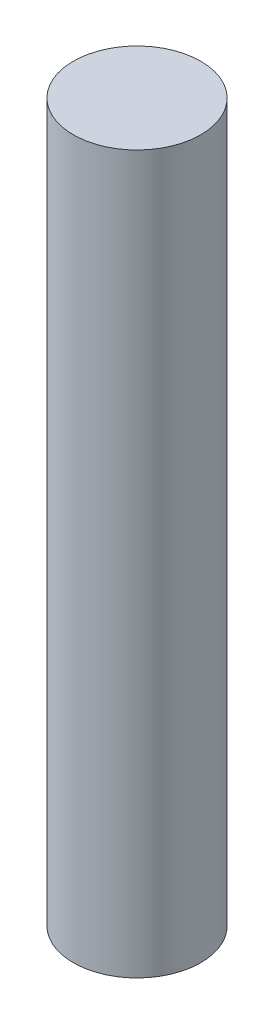
ISO-10303-21;
HEADER;
FILE_DESCRIPTION(('STEP AP214'),'2;1');
FILE_NAME('part.step','',(''),(''),'','','');
FILE_SCHEMA(('AUTOMOTIVE_DESIGN { 1 0 10303 214 1 1 1 1 }'));
ENDSEC;
DATA;
#1=APPLICATION_CONTEXT('core data for automotive mechanical design processes');
#2=APPLICATION_PROTOCOL_DEFINITION('international standard','automotive_design',2000,#1);
#3=PRODUCT_CONTEXT('',#1,'mechanical');
#4=PRODUCT('Part','Part','',(#3));
#5=PRODUCT_RELATED_PRODUCT_CATEGORY('part','',(#4));
#6=PRODUCT_DEFINITION_FORMATION('','',#4);
#7=PRODUCT_DEFINITION_CONTEXT('part definition',#1,'design');
#8=PRODUCT_DEFINITION('design','',#6,#7);
#9=PRODUCT_DEFINITION_SHAPE('','',#8);
#10=(LENGTH_UNIT() NAMED_UNIT(*) SI_UNIT(.MILLI.,.METRE.));
#11=(NAMED_UNIT(*) PLANE_ANGLE_UNIT() SI_UNIT($,.RADIAN.));
#12=(NAMED_UNIT(*) SI_UNIT($,.STERADIAN.) SOLID_ANGLE_UNIT());
#13=UNCERTAINTY_MEASURE_WITH_UNIT(LENGTH_MEASURE(1.E-05),#10,'distance_accuracy_value','');
#14=(GEOMETRIC_REPRESENTATION_CONTEXT(3) GLOBAL_UNCERTAINTY_ASSIGNED_CONTEXT((#13)) GLOBAL_UNIT_ASSIGNED_CONTEXT((#10,
#11,#12)) REPRESENTATION_CONTEXT('',''));
#15=CARTESIAN_POINT('',(0.,0.,0.));
#16=DIRECTION('',(0.,0.,1.));
#17=DIRECTION('',(1.,0.,0.));
#18=AXIS2_PLACEMENT_3D('',#15,#16,#17);
#19=CARTESIAN_POINT('',(350.,560.,-300.));
#20=DIRECTION('',(0.,-1.,0.));
#21=DIRECTION('',(0.,0.,-1.));
#22=AXIS2_PLACEMENT_3D('',#19,#20,#21);
#23=CYLINDRICAL_SURFACE('',#22,8.00000000000001);
#24=CARTESIAN_POINT('',(350.,560.,-300.));
#25=DIRECTION('',(0.,1.,0.));
#26=DIRECTION('',(0.,0.,1.));
#27=AXIS2_PLACEMENT_3D('',#24,#25,#26);
#28=CIRCLE('',#27,8.00000000000001);
#29=CARTESIAN_POINT('',(350.,560.,-308.));
#30=VERTEX_POINT('',#29);
#31=EDGE_CURVE('E10',#30,#30,#28,.T.);
#32=CARTESIAN_POINT('',(350.,470.,-300.));
#33=DIRECTION('',(0.,1.,0.));
#34=DIRECTION('',(0.,0.,1.));
#35=AXIS2_PLACEMENT_3D('',#32,#33,#34);
#36=CIRCLE('',#35,8.00000000000001);
#37=CARTESIAN_POINT('',(350.,470.,-308.));
#38=VERTEX_POINT('',#37);
#39=EDGE_CURVE('E40',#38,#38,#36,.T.);
#40=CARTESIAN_POINT('',(350.,560.,-308.));
#41=CARTESIAN_POINT('',(350.,559.0625,-308.));
#42=CARTESIAN_POINT('',(350.,558.125,-308.));
#43=CARTESIAN_POINT('',(350.,556.25,-308.));
#44=CARTESIAN_POINT('',(350.,555.3125,-308.));
#45=CARTESIAN_POINT('',(350.,553.4375,-308.));
#46=CARTESIAN_POINT('',(350.,552.5,-308.));
#47=CARTESIAN_POINT('',(350.,550.625,-308.));
#48=CARTESIAN_POINT('',(350.,549.6875,-308.));
#49=CARTESIAN_POINT('',(350.,547.8125,-308.));
#50=CARTESIAN_POINT('',(350.,546.875,-308.));
#51=CARTESIAN_POINT('',(350.,545.,-308.));
#52=CARTESIAN_POINT('',(350.,544.0625,-308.));
#53=CARTESIAN_POINT('',(350.,542.1875,-308.));
#54=CARTESIAN_POINT('',(350.,541.25,-308.));
#55=CARTESIAN_POINT('',(350.,539.375,-308.));
#56=CARTESIAN_POINT('',(350.,538.4375,-308.));
#57=CARTESIAN_POINT('',(350.,536.5625,-308.));
#58=CARTESIAN_POINT('',(350.,535.625,-308.));
#59=CARTESIAN_POINT('',(350.,533.75,-308.));
#60=CARTESIAN_POINT('',(350.,532.8125,-308.));
#61=CARTESIAN_POINT('',(350.,530.9375,-308.));
#62=CARTESIAN_POINT('',(350.,530.,-308.));
#63=CARTESIAN_POINT('',(350.,528.125,-308.));
#64=CARTESIAN_POINT('',(350.,527.1875,-308.));
#65=CARTESIAN_POINT('',(350.,525.3125,-308.));
#66=CARTESIAN_POINT('',(350.,524.375,-308.));
#67=CARTESIAN_POINT('',(350.,522.5,-308.));
#68=CARTESIAN_POINT('',(350.,521.5625,-308.));
#69=CARTESIAN_POINT('',(350.,519.6875,-308.));
#70=CARTESIAN_POINT('',(350.,518.75,-308.));
#71=CARTESIAN_POINT('',(350.,516.875,-308.));
#72=CARTESIAN_POINT('',(350.,515.9375,-308.));
#73=CARTESIAN_POINT('',(350.,514.0625,-308.));
#74=CARTESIAN_POINT('',(350.,513.125,-308.));
#75=CARTESIAN_POINT('',(350.,511.25,-308.));
#76=CARTESIAN_POINT('',(350.,510.3125,-308.));
#77=CARTESIAN_POINT('',(350.,508.4375,-308.));
#78=CARTESIAN_POINT('',(350.,507.5,-308.));
#79=CARTESIAN_POINT('',(350.,505.625,-308.));
#80=CARTESIAN_POINT('',(350.,504.6875,-308.));
#81=CARTESIAN_POINT('',(350.,502.8125,-308.));
#82=CARTESIAN_POINT('',(350.,501.875,-308.));
#83=CARTESIAN_POINT('',(350.,500.,-308.));
#84=CARTESIAN_POINT('',(350.,499.0625,-308.));
#85=CARTESIAN_POINT('',(350.,497.1875,-308.));
#86=CARTESIAN_POINT('',(350.,496.25,-308.));
#87=CARTESIAN_POINT('',(350.,494.375,-308.));
#88=CARTESIAN_POINT('',(350.,493.4375,-308.));
#89=CARTESIAN_POINT('',(350.,491.5625,-308.));
#90=CARTESIAN_POINT('',(350.,490.625,-308.));
#91=CARTESIAN_POINT('',(350.,488.75,-308.));
#92=CARTESIAN_POINT('',(350.,487.8125,-308.));
#93=CARTESIAN_POINT('',(350.,485.9375,-308.));
#94=CARTESIAN_POINT('',(350.,485.,-308.));
#95=CARTESIAN_POINT('',(350.,483.125,-308.));
#96=CARTESIAN_POINT('',(350.,482.1875,-308.));
#97=CARTESIAN_POINT('',(350.,480.3125,-308.));
#98=CARTESIAN_POINT('',(350.,479.375,-308.));
#99=CARTESIAN_POINT('',(350.,477.5,-308.));
#100=CARTESIAN_POINT('',(350.,476.5625,-308.));
#101=CARTESIAN_POINT('',(350.,474.6875,-308.));
#102=CARTESIAN_POINT('',(350.,473.75,-308.));
#103=CARTESIAN_POINT('',(350.,471.875,-308.));
#104=CARTESIAN_POINT('',(350.,470.9375,-308.));
#105=CARTESIAN_POINT('',(350.,470.,-308.));
#106=B_SPLINE_CURVE_WITH_KNOTS('',3,(#40,#41,#42,#43,#44,#45,#46,#47,#48,#49,#50,#51,#52,#53,
#54,#55,#56,#57,#58,#59,#60,#61,#62,#63,#64,#65,#66,#67,#68,#69,#70,#71,#72,#73,#74,#75,#76,#77,
#78,#79,#80,#81,#82,#83,#84,#85,#86,#87,#88,#89,#90,#91,#92,#93,#94,#95,#96,#97,#98,#99,#100,
#101,#102,#103,#104,#105),.UNSPECIFIED.,.F.,.F.,(4,2,2,2,2,2,2,2,2,2,2,2,2,2,2,2,2,2,2,2,2,2,2,
2,2,2,2,2,2,2,2,2,4),(0.,2.8125,5.62499999999999,8.43749999999999,11.25,14.0625,16.875,19.6875,
22.5,25.3125,28.125,30.9375,33.7499999999999,36.5624999999999,39.3749999999999,42.1874999999999,
44.9999999999999,47.8124999999999,50.6249999999999,53.4374999999999,56.2499999999999,
59.0624999999999,61.875,64.6874999999999,67.4999999999999,70.3124999999999,73.1249999999999,
75.9374999999999,78.7499999999999,81.5624999999999,84.3749999999999,87.1874999999999,
89.9999999999999),.UNSPECIFIED.);
#107=EDGE_CURVE('BSEAM37',#30,#38,#106,.T.);
#108=ORIENTED_EDGE('',*,*,#31,.F.);
#109=ORIENTED_EDGE('',*,*,#39,.T.);
#110=ORIENTED_EDGE('',*,*,#107,.T.);
#111=ORIENTED_EDGE('',*,*,#107,.F.);
#112=EDGE_LOOP('',(#108,#110,#109,#111));
#113=FACE_BOUND('',#112,.T.);
#114=ADVANCED_FACE('F37',(#113),#23,.T.);
#115=CARTESIAN_POINT('',(350.,560.,-300.));
#116=DIRECTION('',(0.,1.,0.));
#117=DIRECTION('',(0.,0.,1.));
#118=AXIS2_PLACEMENT_3D('',#115,#116,#117);
#119=PLANE('',#118);
#120=ORIENTED_EDGE('',*,*,#31,.T.);
#121=EDGE_LOOP('',(#120));
#122=FACE_BOUND('',#121,.T.);
#123=ADVANCED_FACE('F52',(#122),#119,.T.);
#124=CARTESIAN_POINT('',(350.,470.,-300.));
#125=DIRECTION('',(0.,1.,0.));
#126=DIRECTION('',(0.,0.,1.));
#127=AXIS2_PLACEMENT_3D('',#124,#125,#126);
#128=PLANE('',#127);
#129=ORIENTED_EDGE('',*,*,#39,.F.);
#130=EDGE_LOOP('',(#129));
#131=FACE_BOUND('',#130,.T.);
#132=ADVANCED_FACE('F50',(#131),#128,.F.);
#133=CLOSED_SHELL('',(#114,#123,#132));
#134=MANIFOLD_SOLID_BREP('B2',#133);
#135=ADVANCED_BREP_SHAPE_REPRESENTATION('',(#18,#134),#14);
#136=SHAPE_DEFINITION_REPRESENTATION(#9,#135);
ENDSEC;
END-ISO-10303-21;
